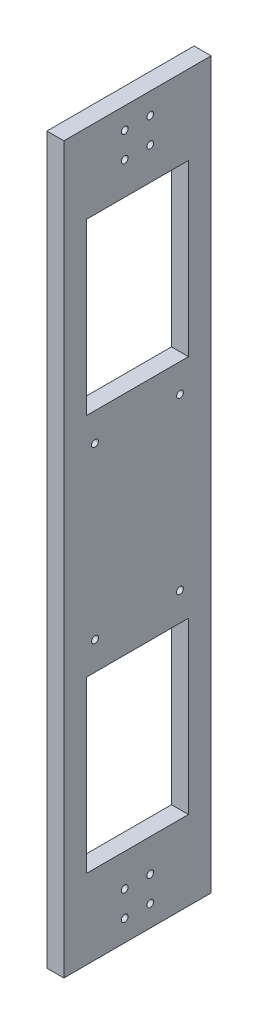
ISO-10303-21;
HEADER;
FILE_DESCRIPTION(('STEP AP214'),'2;1');
FILE_NAME('part.step','',(''),(''),'','','');
FILE_SCHEMA(('AUTOMOTIVE_DESIGN { 1 0 10303 214 1 1 1 1 }'));
ENDSEC;
DATA;
#1=APPLICATION_CONTEXT('core data for automotive mechanical design processes');
#2=APPLICATION_PROTOCOL_DEFINITION('international standard','automotive_design',2000,#1);
#3=PRODUCT_CONTEXT('',#1,'mechanical');
#4=PRODUCT('Part','Part','',(#3));
#5=PRODUCT_RELATED_PRODUCT_CATEGORY('part','',(#4));
#6=PRODUCT_DEFINITION_FORMATION('','',#4);
#7=PRODUCT_DEFINITION_CONTEXT('part definition',#1,'design');
#8=PRODUCT_DEFINITION('design','',#6,#7);
#9=PRODUCT_DEFINITION_SHAPE('','',#8);
#10=(LENGTH_UNIT() NAMED_UNIT(*) SI_UNIT(.MILLI.,.METRE.));
#11=(NAMED_UNIT(*) PLANE_ANGLE_UNIT() SI_UNIT($,.RADIAN.));
#12=(NAMED_UNIT(*) SI_UNIT($,.STERADIAN.) SOLID_ANGLE_UNIT());
#13=UNCERTAINTY_MEASURE_WITH_UNIT(LENGTH_MEASURE(1.E-05),#10,'distance_accuracy_value','');
#14=(GEOMETRIC_REPRESENTATION_CONTEXT(3) GLOBAL_UNCERTAINTY_ASSIGNED_CONTEXT((#13)) GLOBAL_UNIT_ASSIGNED_CONTEXT((#10,
#11,#12)) REPRESENTATION_CONTEXT('',''));
#15=CARTESIAN_POINT('',(0.,0.,0.));
#16=DIRECTION('',(0.,0.,1.));
#17=DIRECTION('',(1.,0.,0.));
#18=AXIS2_PLACEMENT_3D('',#15,#16,#17);
#19=CARTESIAN_POINT('',(-151.1,0.,0.));
#20=DIRECTION('',(-1.,0.,0.));
#21=DIRECTION('',(0.,0.,1.));
#22=AXIS2_PLACEMENT_3D('',#19,#20,#21);
#23=PLANE('',#22);
#24=DIRECTION('',(0.,-1.,0.));
#25=VECTOR('',#24,1.);
#26=CARTESIAN_POINT('',(-151.1,40.,18.));
#27=LINE('',#26,#25);
#28=CARTESIAN_POINT('',(-151.1,100.,18.));
#29=VERTEX_POINT('',#28);
#30=CARTESIAN_POINT('',(-151.1,40.,18.));
#31=VERTEX_POINT('',#30);
#32=EDGE_CURVE('E177',#29,#31,#27,.T.);
#33=ORIENTED_EDGE('',*,*,#32,.F.);
#34=DIRECTION('',(0.,0.,1.));
#35=VECTOR('',#34,1.);
#36=CARTESIAN_POINT('',(-151.1,100.,18.));
#37=LINE('',#36,#35);
#38=CARTESIAN_POINT('',(-151.1,100.,-18.));
#39=VERTEX_POINT('',#38);
#40=EDGE_CURVE('E188',#39,#29,#37,.T.);
#41=ORIENTED_EDGE('',*,*,#40,.F.);
#42=DIRECTION('',(0.,1.,0.));
#43=VECTOR('',#42,1.);
#44=CARTESIAN_POINT('',(-151.1,40.,-18.));
#45=LINE('',#44,#43);
#46=CARTESIAN_POINT('',(-151.1,40.,-18.));
#47=VERTEX_POINT('',#46);
#48=EDGE_CURVE('E184',#47,#39,#45,.T.);
#49=ORIENTED_EDGE('',*,*,#48,.F.);
#50=DIRECTION('',(0.,0.,-1.));
#51=VECTOR('',#50,1.);
#52=CARTESIAN_POINT('',(-151.1,40.,18.));
#53=LINE('',#52,#51);
#54=EDGE_CURVE('E180',#31,#47,#53,.T.);
#55=ORIENTED_EDGE('',*,*,#54,.F.);
#56=EDGE_LOOP('',(#33,#41,#49,#55));
#57=FACE_BOUND('',#56,.T.);
#58=CARTESIAN_POINT('',(-151.1,30.,15.));
#59=DIRECTION('',(-1.,0.,0.));
#60=DIRECTION('',(0.,0.,1.));
#61=AXIS2_PLACEMENT_3D('',#58,#59,#60);
#62=CIRCLE('',#61,1.19999999999999);
#63=CARTESIAN_POINT('',(-151.1,30.,16.2));
#64=VERTEX_POINT('',#63);
#65=EDGE_CURVE('E223',#64,#64,#62,.T.);
#66=ORIENTED_EDGE('',*,*,#65,.T.);
#67=EDGE_LOOP('',(#66));
#68=FACE_BOUND('',#67,.T.);
#69=CARTESIAN_POINT('',(-151.1,30.,-15.));
#70=DIRECTION('',(-1.,0.,0.));
#71=DIRECTION('',(0.,0.,1.));
#72=AXIS2_PLACEMENT_3D('',#69,#70,#71);
#73=CIRCLE('',#72,1.19999999999999);
#74=CARTESIAN_POINT('',(-151.1,30.,-13.8));
#75=VERTEX_POINT('',#74);
#76=EDGE_CURVE('E231',#75,#75,#73,.T.);
#77=ORIENTED_EDGE('',*,*,#76,.T.);
#78=EDGE_LOOP('',(#77));
#79=FACE_BOUND('',#78,.T.);
#80=CARTESIAN_POINT('',(-151.1,-30.,15.));
#81=DIRECTION('',(-1.,0.,0.));
#82=DIRECTION('',(0.,0.,1.));
#83=AXIS2_PLACEMENT_3D('',#80,#81,#82);
#84=CIRCLE('',#83,1.19999999999999);
#85=CARTESIAN_POINT('',(-151.1,-30.,16.2));
#86=VERTEX_POINT('',#85);
#87=EDGE_CURVE('E239',#86,#86,#84,.T.);
#88=ORIENTED_EDGE('',*,*,#87,.T.);
#89=EDGE_LOOP('',(#88));
#90=FACE_BOUND('',#89,.T.);
#91=CARTESIAN_POINT('',(-151.1,-30.,-15.));
#92=DIRECTION('',(-1.,0.,0.));
#93=DIRECTION('',(0.,0.,1.));
#94=AXIS2_PLACEMENT_3D('',#91,#92,#93);
#95=CIRCLE('',#94,1.19999999999999);
#96=CARTESIAN_POINT('',(-151.1,-30.,-13.8));
#97=VERTEX_POINT('',#96);
#98=EDGE_CURVE('E247',#97,#97,#95,.T.);
#99=ORIENTED_EDGE('',*,*,#98,.T.);
#100=EDGE_LOOP('',(#99));
#101=FACE_BOUND('',#100,.T.);
#102=CARTESIAN_POINT('',(-151.1,-111.5,4.5));
#103=DIRECTION('',(-1.,0.,0.));
#104=DIRECTION('',(0.,0.,1.));
#105=AXIS2_PLACEMENT_3D('',#102,#103,#104);
#106=CIRCLE('',#105,1.19999999999999);
#107=CARTESIAN_POINT('',(-151.1,-111.5,5.69999999999999));
#108=VERTEX_POINT('',#107);
#109=EDGE_CURVE('E255',#108,#108,#106,.T.);
#110=ORIENTED_EDGE('',*,*,#109,.T.);
#111=EDGE_LOOP('',(#110));
#112=FACE_BOUND('',#111,.T.);
#113=CARTESIAN_POINT('',(-151.1,-111.5,-4.5));
#114=DIRECTION('',(-1.,0.,0.));
#115=DIRECTION('',(0.,0.,1.));
#116=AXIS2_PLACEMENT_3D('',#113,#114,#115);
#117=CIRCLE('',#116,1.19999999999999);
#118=CARTESIAN_POINT('',(-151.1,-111.5,-3.30000000000001));
#119=VERTEX_POINT('',#118);
#120=EDGE_CURVE('E263',#119,#119,#117,.T.);
#121=ORIENTED_EDGE('',*,*,#120,.T.);
#122=EDGE_LOOP('',(#121));
#123=FACE_BOUND('',#122,.T.);
#124=CARTESIAN_POINT('',(-151.1,-120.5,4.5));
#125=DIRECTION('',(-1.,0.,0.));
#126=DIRECTION('',(0.,0.,1.));
#127=AXIS2_PLACEMENT_3D('',#124,#125,#126);
#128=CIRCLE('',#127,1.19999999999999);
#129=CARTESIAN_POINT('',(-151.1,-120.5,5.69999999999999));
#130=VERTEX_POINT('',#129);
#131=EDGE_CURVE('E271',#130,#130,#128,.T.);
#132=ORIENTED_EDGE('',*,*,#131,.T.);
#133=EDGE_LOOP('',(#132));
#134=FACE_BOUND('',#133,.T.);
#135=CARTESIAN_POINT('',(-151.1,-120.5,-4.5));
#136=DIRECTION('',(-1.,0.,0.));
#137=DIRECTION('',(0.,0.,1.));
#138=AXIS2_PLACEMENT_3D('',#135,#136,#137);
#139=CIRCLE('',#138,1.19999999999999);
#140=CARTESIAN_POINT('',(-151.1,-120.5,-3.30000000000001));
#141=VERTEX_POINT('',#140);
#142=EDGE_CURVE('E279',#141,#141,#139,.T.);
#143=ORIENTED_EDGE('',*,*,#142,.T.);
#144=EDGE_LOOP('',(#143));
#145=FACE_BOUND('',#144,.T.);
#146=CARTESIAN_POINT('',(-151.1,120.5,4.5));
#147=DIRECTION('',(-1.,0.,0.));
#148=DIRECTION('',(0.,0.,1.));
#149=AXIS2_PLACEMENT_3D('',#146,#147,#148);
#150=CIRCLE('',#149,1.19999999999999);
#151=CARTESIAN_POINT('',(-151.1,120.5,5.69999999999999));
#152=VERTEX_POINT('',#151);
#153=EDGE_CURVE('E287',#152,#152,#150,.T.);
#154=ORIENTED_EDGE('',*,*,#153,.T.);
#155=EDGE_LOOP('',(#154));
#156=FACE_BOUND('',#155,.T.);
#157=CARTESIAN_POINT('',(-151.1,120.5,-4.5));
#158=DIRECTION('',(-1.,0.,0.));
#159=DIRECTION('',(0.,0.,1.));
#160=AXIS2_PLACEMENT_3D('',#157,#158,#159);
#161=CIRCLE('',#160,1.19999999999999);
#162=CARTESIAN_POINT('',(-151.1,120.5,-3.30000000000001));
#163=VERTEX_POINT('',#162);
#164=EDGE_CURVE('E295',#163,#163,#161,.T.);
#165=ORIENTED_EDGE('',*,*,#164,.T.);
#166=EDGE_LOOP('',(#165));
#167=FACE_BOUND('',#166,.T.);
#168=CARTESIAN_POINT('',(-151.1,111.5,4.5));
#169=DIRECTION('',(-1.,0.,0.));
#170=DIRECTION('',(0.,0.,1.));
#171=AXIS2_PLACEMENT_3D('',#168,#169,#170);
#172=CIRCLE('',#171,1.19999999999999);
#173=CARTESIAN_POINT('',(-151.1,111.5,5.69999999999999));
#174=VERTEX_POINT('',#173);
#175=EDGE_CURVE('E303',#174,#174,#172,.T.);
#176=ORIENTED_EDGE('',*,*,#175,.T.);
#177=EDGE_LOOP('',(#176));
#178=FACE_BOUND('',#177,.T.);
#179=CARTESIAN_POINT('',(-151.1,111.5,-4.5));
#180=DIRECTION('',(-1.,0.,0.));
#181=DIRECTION('',(0.,0.,1.));
#182=AXIS2_PLACEMENT_3D('',#179,#180,#181);
#183=CIRCLE('',#182,1.19999999999999);
#184=CARTESIAN_POINT('',(-151.1,111.5,-3.30000000000001));
#185=VERTEX_POINT('',#184);
#186=EDGE_CURVE('E311',#185,#185,#183,.T.);
#187=ORIENTED_EDGE('',*,*,#186,.T.);
#188=EDGE_LOOP('',(#187));
#189=FACE_BOUND('',#188,.T.);
#190=DIRECTION('',(0.,-1.,0.));
#191=VECTOR('',#190,1.);
#192=CARTESIAN_POINT('',(-151.1,-128.,26.));
#193=LINE('',#192,#191);
#194=CARTESIAN_POINT('',(-151.1,128.,26.));
#195=VERTEX_POINT('',#194);
#196=CARTESIAN_POINT('',(-151.1,-128.,26.));
#197=VERTEX_POINT('',#196);
#198=EDGE_CURVE('E316',#195,#197,#193,.T.);
#199=ORIENTED_EDGE('',*,*,#198,.T.);
#200=DIRECTION('',(0.,0.,-1.));
#201=VECTOR('',#200,1.);
#202=CARTESIAN_POINT('',(-151.1,-128.,26.));
#203=LINE('',#202,#201);
#204=CARTESIAN_POINT('',(-151.1,-128.,-26.));
#205=VERTEX_POINT('',#204);
#206=EDGE_CURVE('E320',#197,#205,#203,.T.);
#207=ORIENTED_EDGE('',*,*,#206,.T.);
#208=DIRECTION('',(0.,1.,0.));
#209=VECTOR('',#208,1.);
#210=CARTESIAN_POINT('',(-151.1,-128.,-26.));
#211=LINE('',#210,#209);
#212=CARTESIAN_POINT('',(-151.1,128.,-26.));
#213=VERTEX_POINT('',#212);
#214=EDGE_CURVE('E324',#205,#213,#211,.T.);
#215=ORIENTED_EDGE('',*,*,#214,.T.);
#216=DIRECTION('',(0.,0.,1.));
#217=VECTOR('',#216,1.);
#218=CARTESIAN_POINT('',(-151.1,128.,26.));
#219=LINE('',#218,#217);
#220=EDGE_CURVE('E327',#213,#195,#219,.T.);
#221=ORIENTED_EDGE('',*,*,#220,.T.);
#222=EDGE_LOOP('',(#199,#207,#215,#221));
#223=FACE_BOUND('',#222,.T.);
#224=DIRECTION('',(0.,-1.,0.));
#225=VECTOR('',#224,1.);
#226=CARTESIAN_POINT('',(-151.1,-100.,18.));
#227=LINE('',#226,#225);
#228=CARTESIAN_POINT('',(-151.1,-40.,18.));
#229=VERTEX_POINT('',#228);
#230=CARTESIAN_POINT('',(-151.1,-100.,18.));
#231=VERTEX_POINT('',#230);
#232=EDGE_CURVE('E129',#229,#231,#227,.T.);
#233=ORIENTED_EDGE('',*,*,#232,.F.);
#234=DIRECTION('',(0.,0.,1.));
#235=VECTOR('',#234,1.);
#236=CARTESIAN_POINT('',(-151.1,-40.,18.));
#237=LINE('',#236,#235);
#238=CARTESIAN_POINT('',(-151.1,-40.,-18.));
#239=VERTEX_POINT('',#238);
#240=EDGE_CURVE('E155',#239,#229,#237,.T.);
#241=ORIENTED_EDGE('',*,*,#240,.F.);
#242=DIRECTION('',(0.,1.,0.));
#243=VECTOR('',#242,1.);
#244=CARTESIAN_POINT('',(-151.1,-100.,-18.));
#245=LINE('',#244,#243);
#246=CARTESIAN_POINT('',(-151.1,-100.,-18.));
#247=VERTEX_POINT('',#246);
#248=EDGE_CURVE('E151',#247,#239,#245,.T.);
#249=ORIENTED_EDGE('',*,*,#248,.F.);
#250=DIRECTION('',(0.,0.,-1.));
#251=VECTOR('',#250,1.);
#252=CARTESIAN_POINT('',(-151.1,-100.,18.));
#253=LINE('',#252,#251);
#254=EDGE_CURVE('E138',#231,#247,#253,.T.);
#255=ORIENTED_EDGE('',*,*,#254,.F.);
#256=EDGE_LOOP('',(#233,#241,#249,#255));
#257=FACE_BOUND('',#256,.T.);
#258=ADVANCED_FACE('F39',(#57,#68,#79,#90,#101,#112,#123,#134,#145,#156,#167,#178,#189,#223,
#257),#23,.F.);
#259=CARTESIAN_POINT('',(-157.1,0.,0.));
#260=DIRECTION('',(-1.,0.,0.));
#261=DIRECTION('',(0.,0.,1.));
#262=AXIS2_PLACEMENT_3D('',#259,#260,#261);
#263=PLANE('',#262);
#264=CARTESIAN_POINT('',(-157.1,30.,15.));
#265=DIRECTION('',(-1.,0.,0.));
#266=DIRECTION('',(0.,0.,1.));
#267=AXIS2_PLACEMENT_3D('',#264,#265,#266);
#268=CIRCLE('',#267,1.19999999999999);
#269=CARTESIAN_POINT('',(-157.1,30.,16.2));
#270=VERTEX_POINT('',#269);
#271=EDGE_CURVE('E219',#270,#270,#268,.T.);
#272=ORIENTED_EDGE('',*,*,#271,.F.);
#273=EDGE_LOOP('',(#272));
#274=FACE_BOUND('',#273,.T.);
#275=CARTESIAN_POINT('',(-157.1,30.,-15.));
#276=DIRECTION('',(-1.,0.,0.));
#277=DIRECTION('',(0.,0.,1.));
#278=AXIS2_PLACEMENT_3D('',#275,#276,#277);
#279=CIRCLE('',#278,1.19999999999999);
#280=CARTESIAN_POINT('',(-157.1,30.,-13.8));
#281=VERTEX_POINT('',#280);
#282=EDGE_CURVE('E227',#281,#281,#279,.T.);
#283=ORIENTED_EDGE('',*,*,#282,.F.);
#284=EDGE_LOOP('',(#283));
#285=FACE_BOUND('',#284,.T.);
#286=CARTESIAN_POINT('',(-157.1,-30.,15.));
#287=DIRECTION('',(-1.,0.,0.));
#288=DIRECTION('',(0.,0.,1.));
#289=AXIS2_PLACEMENT_3D('',#286,#287,#288);
#290=CIRCLE('',#289,1.19999999999999);
#291=CARTESIAN_POINT('',(-157.1,-30.,16.2));
#292=VERTEX_POINT('',#291);
#293=EDGE_CURVE('E235',#292,#292,#290,.T.);
#294=ORIENTED_EDGE('',*,*,#293,.F.);
#295=EDGE_LOOP('',(#294));
#296=FACE_BOUND('',#295,.T.);
#297=CARTESIAN_POINT('',(-157.1,-30.,-15.));
#298=DIRECTION('',(-1.,0.,0.));
#299=DIRECTION('',(0.,0.,1.));
#300=AXIS2_PLACEMENT_3D('',#297,#298,#299);
#301=CIRCLE('',#300,1.19999999999999);
#302=CARTESIAN_POINT('',(-157.1,-30.,-13.8));
#303=VERTEX_POINT('',#302);
#304=EDGE_CURVE('E243',#303,#303,#301,.T.);
#305=ORIENTED_EDGE('',*,*,#304,.F.);
#306=EDGE_LOOP('',(#305));
#307=FACE_BOUND('',#306,.T.);
#308=CARTESIAN_POINT('',(-157.1,-111.5,4.5));
#309=DIRECTION('',(-1.,0.,0.));
#310=DIRECTION('',(0.,0.,1.));
#311=AXIS2_PLACEMENT_3D('',#308,#309,#310);
#312=CIRCLE('',#311,1.19999999999999);
#313=CARTESIAN_POINT('',(-157.1,-111.5,5.69999999999999));
#314=VERTEX_POINT('',#313);
#315=EDGE_CURVE('E251',#314,#314,#312,.T.);
#316=ORIENTED_EDGE('',*,*,#315,.F.);
#317=EDGE_LOOP('',(#316));
#318=FACE_BOUND('',#317,.T.);
#319=CARTESIAN_POINT('',(-157.1,-111.5,-4.5));
#320=DIRECTION('',(-1.,0.,0.));
#321=DIRECTION('',(0.,0.,1.));
#322=AXIS2_PLACEMENT_3D('',#319,#320,#321);
#323=CIRCLE('',#322,1.19999999999999);
#324=CARTESIAN_POINT('',(-157.1,-111.5,-3.30000000000001));
#325=VERTEX_POINT('',#324);
#326=EDGE_CURVE('E259',#325,#325,#323,.T.);
#327=ORIENTED_EDGE('',*,*,#326,.F.);
#328=EDGE_LOOP('',(#327));
#329=FACE_BOUND('',#328,.T.);
#330=CARTESIAN_POINT('',(-157.1,-120.5,4.5));
#331=DIRECTION('',(-1.,0.,0.));
#332=DIRECTION('',(0.,0.,1.));
#333=AXIS2_PLACEMENT_3D('',#330,#331,#332);
#334=CIRCLE('',#333,1.19999999999999);
#335=CARTESIAN_POINT('',(-157.1,-120.5,5.69999999999999));
#336=VERTEX_POINT('',#335);
#337=EDGE_CURVE('E267',#336,#336,#334,.T.);
#338=ORIENTED_EDGE('',*,*,#337,.F.);
#339=EDGE_LOOP('',(#338));
#340=FACE_BOUND('',#339,.T.);
#341=CARTESIAN_POINT('',(-157.1,-120.5,-4.5));
#342=DIRECTION('',(-1.,0.,0.));
#343=DIRECTION('',(0.,0.,1.));
#344=AXIS2_PLACEMENT_3D('',#341,#342,#343);
#345=CIRCLE('',#344,1.19999999999999);
#346=CARTESIAN_POINT('',(-157.1,-120.5,-3.30000000000001));
#347=VERTEX_POINT('',#346);
#348=EDGE_CURVE('E275',#347,#347,#345,.T.);
#349=ORIENTED_EDGE('',*,*,#348,.F.);
#350=EDGE_LOOP('',(#349));
#351=FACE_BOUND('',#350,.T.);
#352=CARTESIAN_POINT('',(-157.1,120.5,4.5));
#353=DIRECTION('',(-1.,0.,0.));
#354=DIRECTION('',(0.,0.,1.));
#355=AXIS2_PLACEMENT_3D('',#352,#353,#354);
#356=CIRCLE('',#355,1.19999999999999);
#357=CARTESIAN_POINT('',(-157.1,120.5,5.69999999999999));
#358=VERTEX_POINT('',#357);
#359=EDGE_CURVE('E283',#358,#358,#356,.T.);
#360=ORIENTED_EDGE('',*,*,#359,.F.);
#361=EDGE_LOOP('',(#360));
#362=FACE_BOUND('',#361,.T.);
#363=CARTESIAN_POINT('',(-157.1,120.5,-4.5));
#364=DIRECTION('',(-1.,0.,0.));
#365=DIRECTION('',(0.,0.,1.));
#366=AXIS2_PLACEMENT_3D('',#363,#364,#365);
#367=CIRCLE('',#366,1.19999999999999);
#368=CARTESIAN_POINT('',(-157.1,120.5,-3.30000000000001));
#369=VERTEX_POINT('',#368);
#370=EDGE_CURVE('E291',#369,#369,#367,.T.);
#371=ORIENTED_EDGE('',*,*,#370,.F.);
#372=EDGE_LOOP('',(#371));
#373=FACE_BOUND('',#372,.T.);
#374=CARTESIAN_POINT('',(-157.1,111.5,4.5));
#375=DIRECTION('',(-1.,0.,0.));
#376=DIRECTION('',(0.,0.,1.));
#377=AXIS2_PLACEMENT_3D('',#374,#375,#376);
#378=CIRCLE('',#377,1.19999999999999);
#379=CARTESIAN_POINT('',(-157.1,111.5,5.69999999999999));
#380=VERTEX_POINT('',#379);
#381=EDGE_CURVE('E299',#380,#380,#378,.T.);
#382=ORIENTED_EDGE('',*,*,#381,.F.);
#383=EDGE_LOOP('',(#382));
#384=FACE_BOUND('',#383,.T.);
#385=CARTESIAN_POINT('',(-157.1,111.5,-4.5));
#386=DIRECTION('',(-1.,0.,0.));
#387=DIRECTION('',(0.,0.,1.));
#388=AXIS2_PLACEMENT_3D('',#385,#386,#387);
#389=CIRCLE('',#388,1.19999999999999);
#390=CARTESIAN_POINT('',(-157.1,111.5,-3.30000000000001));
#391=VERTEX_POINT('',#390);
#392=EDGE_CURVE('E307',#391,#391,#389,.T.);
#393=ORIENTED_EDGE('',*,*,#392,.F.);
#394=EDGE_LOOP('',(#393));
#395=FACE_BOUND('',#394,.T.);
#396=DIRECTION('',(0.,-1.,0.));
#397=VECTOR('',#396,1.);
#398=CARTESIAN_POINT('',(-157.1,-128.,26.));
#399=LINE('',#398,#397);
#400=CARTESIAN_POINT('',(-157.1,128.,26.));
#401=VERTEX_POINT('',#400);
#402=CARTESIAN_POINT('',(-157.1,-128.,26.));
#403=VERTEX_POINT('',#402);
#404=EDGE_CURVE('E315',#401,#403,#399,.T.);
#405=ORIENTED_EDGE('',*,*,#404,.F.);
#406=DIRECTION('',(0.,0.,1.));
#407=VECTOR('',#406,1.);
#408=CARTESIAN_POINT('',(-157.1,128.,26.));
#409=LINE('',#408,#407);
#410=CARTESIAN_POINT('',(-157.1,128.,-26.));
#411=VERTEX_POINT('',#410);
#412=EDGE_CURVE('E321',#411,#401,#409,.T.);
#413=ORIENTED_EDGE('',*,*,#412,.F.);
#414=DIRECTION('',(0.,1.,0.));
#415=VECTOR('',#414,1.);
#416=CARTESIAN_POINT('',(-157.1,-128.,-26.));
#417=LINE('',#416,#415);
#418=CARTESIAN_POINT('',(-157.1,-128.,-26.));
#419=VERTEX_POINT('',#418);
#420=EDGE_CURVE('E337',#419,#411,#417,.T.);
#421=ORIENTED_EDGE('',*,*,#420,.F.);
#422=DIRECTION('',(0.,0.,-1.));
#423=VECTOR('',#422,1.);
#424=CARTESIAN_POINT('',(-157.1,-128.,26.));
#425=LINE('',#424,#423);
#426=EDGE_CURVE('E334',#403,#419,#425,.T.);
#427=ORIENTED_EDGE('',*,*,#426,.F.);
#428=EDGE_LOOP('',(#405,#413,#421,#427));
#429=FACE_BOUND('',#428,.T.);
#430=DIRECTION('',(0.,0.,1.));
#431=VECTOR('',#430,1.);
#432=CARTESIAN_POINT('',(-157.1,100.,18.));
#433=LINE('',#432,#431);
#434=CARTESIAN_POINT('',(-157.1,100.,-18.));
#435=VERTEX_POINT('',#434);
#436=CARTESIAN_POINT('',(-157.1,100.,18.));
#437=VERTEX_POINT('',#436);
#438=EDGE_CURVE('E181',#435,#437,#433,.T.);
#439=ORIENTED_EDGE('',*,*,#438,.T.);
#440=DIRECTION('',(0.,-1.,0.));
#441=VECTOR('',#440,1.);
#442=CARTESIAN_POINT('',(-157.1,40.,18.));
#443=LINE('',#442,#441);
#444=CARTESIAN_POINT('',(-157.1,40.,18.));
#445=VERTEX_POINT('',#444);
#446=EDGE_CURVE('E147',#437,#445,#443,.T.);
#447=ORIENTED_EDGE('',*,*,#446,.T.);
#448=DIRECTION('',(0.,0.,-1.));
#449=VECTOR('',#448,1.);
#450=CARTESIAN_POINT('',(-157.1,40.,18.));
#451=LINE('',#450,#449);
#452=CARTESIAN_POINT('',(-157.1,40.,-18.));
#453=VERTEX_POINT('',#452);
#454=EDGE_CURVE('E195',#445,#453,#451,.T.);
#455=ORIENTED_EDGE('',*,*,#454,.T.);
#456=DIRECTION('',(0.,1.,0.));
#457=VECTOR('',#456,1.);
#458=CARTESIAN_POINT('',(-157.1,40.,-18.));
#459=LINE('',#458,#457);
#460=EDGE_CURVE('E199',#453,#435,#459,.T.);
#461=ORIENTED_EDGE('',*,*,#460,.T.);
#462=EDGE_LOOP('',(#439,#447,#455,#461));
#463=FACE_BOUND('',#462,.T.);
#464=DIRECTION('',(0.,0.,1.));
#465=VECTOR('',#464,1.);
#466=CARTESIAN_POINT('',(-157.1,-40.,18.));
#467=LINE('',#466,#465);
#468=CARTESIAN_POINT('',(-157.1,-40.,-18.));
#469=VERTEX_POINT('',#468);
#470=CARTESIAN_POINT('',(-157.1,-40.,18.));
#471=VERTEX_POINT('',#470);
#472=EDGE_CURVE('E139',#469,#471,#467,.T.);
#473=ORIENTED_EDGE('',*,*,#472,.T.);
#474=DIRECTION('',(0.,-1.,0.));
#475=VECTOR('',#474,1.);
#476=CARTESIAN_POINT('',(-157.1,-100.,18.));
#477=LINE('',#476,#475);
#478=CARTESIAN_POINT('',(-157.1,-100.,18.));
#479=VERTEX_POINT('',#478);
#480=EDGE_CURVE('E63',#471,#479,#477,.T.);
#481=ORIENTED_EDGE('',*,*,#480,.T.);
#482=DIRECTION('',(0.,0.,-1.));
#483=VECTOR('',#482,1.);
#484=CARTESIAN_POINT('',(-157.1,-100.,18.));
#485=LINE('',#484,#483);
#486=CARTESIAN_POINT('',(-157.1,-100.,-18.));
#487=VERTEX_POINT('',#486);
#488=EDGE_CURVE('E145',#479,#487,#485,.T.);
#489=ORIENTED_EDGE('',*,*,#488,.T.);
#490=DIRECTION('',(0.,1.,0.));
#491=VECTOR('',#490,1.);
#492=CARTESIAN_POINT('',(-157.1,-100.,-18.));
#493=LINE('',#492,#491);
#494=EDGE_CURVE('E164',#487,#469,#493,.T.);
#495=ORIENTED_EDGE('',*,*,#494,.T.);
#496=EDGE_LOOP('',(#473,#481,#489,#495));
#497=FACE_BOUND('',#496,.T.);
#498=ADVANCED_FACE('F360',(#274,#285,#296,#307,#318,#329,#340,#351,#362,#373,#384,#395,#429,
#463,#497),#263,.T.);
#499=CARTESIAN_POINT('',(-151.1,-128.,26.));
#500=DIRECTION('',(0.,0.,-1.));
#501=DIRECTION('',(-1.,0.,0.));
#502=AXIS2_PLACEMENT_3D('',#499,#500,#501);
#503=PLANE('',#502);
#504=ORIENTED_EDGE('',*,*,#404,.T.);
#505=DIRECTION('',(-1.,0.,0.));
#506=VECTOR('',#505,1.);
#507=CARTESIAN_POINT('',(-151.1,-128.,26.));
#508=LINE('',#507,#506);
#509=EDGE_CURVE('E11',#197,#403,#508,.T.);
#510=ORIENTED_EDGE('',*,*,#509,.F.);
#511=ORIENTED_EDGE('',*,*,#198,.F.);
#512=DIRECTION('',(-1.,0.,0.));
#513=VECTOR('',#512,1.);
#514=CARTESIAN_POINT('',(-151.1,128.,26.));
#515=LINE('',#514,#513);
#516=EDGE_CURVE('E330',#195,#401,#515,.T.);
#517=ORIENTED_EDGE('',*,*,#516,.T.);
#518=EDGE_LOOP('',(#504,#510,#511,#517));
#519=FACE_BOUND('',#518,.T.);
#520=ADVANCED_FACE('F41',(#519),#503,.F.);
#521=CARTESIAN_POINT('',(-151.1,-128.,26.));
#522=DIRECTION('',(0.,1.,0.));
#523=DIRECTION('',(0.,0.,1.));
#524=AXIS2_PLACEMENT_3D('',#521,#522,#523);
#525=PLANE('',#524);
#526=ORIENTED_EDGE('',*,*,#426,.T.);
#527=DIRECTION('',(-1.,0.,0.));
#528=VECTOR('',#527,1.);
#529=CARTESIAN_POINT('',(-151.1,-128.,-26.));
#530=LINE('',#529,#528);
#531=EDGE_CURVE('E48',#205,#419,#530,.T.);
#532=ORIENTED_EDGE('',*,*,#531,.F.);
#533=ORIENTED_EDGE('',*,*,#206,.F.);
#534=ORIENTED_EDGE('',*,*,#509,.T.);
#535=EDGE_LOOP('',(#526,#532,#533,#534));
#536=FACE_BOUND('',#535,.T.);
#537=ADVANCED_FACE('F370',(#536),#525,.F.);
#538=CARTESIAN_POINT('',(-151.1,-128.,-26.));
#539=DIRECTION('',(0.,0.,1.));
#540=DIRECTION('',(1.,0.,0.));
#541=AXIS2_PLACEMENT_3D('',#538,#539,#540);
#542=PLANE('',#541);
#543=ORIENTED_EDGE('',*,*,#420,.T.);
#544=DIRECTION('',(-1.,0.,0.));
#545=VECTOR('',#544,1.);
#546=CARTESIAN_POINT('',(-151.1,128.,-26.));
#547=LINE('',#546,#545);
#548=EDGE_CURVE('E345',#213,#411,#547,.T.);
#549=ORIENTED_EDGE('',*,*,#548,.F.);
#550=ORIENTED_EDGE('',*,*,#214,.F.);
#551=ORIENTED_EDGE('',*,*,#531,.T.);
#552=EDGE_LOOP('',(#543,#549,#550,#551));
#553=FACE_BOUND('',#552,.T.);
#554=ADVANCED_FACE('F354',(#553),#542,.F.);
#555=CARTESIAN_POINT('',(-151.1,128.,26.));
#556=DIRECTION('',(0.,-1.,0.));
#557=DIRECTION('',(0.,0.,-1.));
#558=AXIS2_PLACEMENT_3D('',#555,#556,#557);
#559=PLANE('',#558);
#560=ORIENTED_EDGE('',*,*,#412,.T.);
#561=ORIENTED_EDGE('',*,*,#516,.F.);
#562=ORIENTED_EDGE('',*,*,#220,.F.);
#563=ORIENTED_EDGE('',*,*,#548,.T.);
#564=EDGE_LOOP('',(#560,#561,#562,#563));
#565=FACE_BOUND('',#564,.T.);
#566=ADVANCED_FACE('F364',(#565),#559,.F.);
#567=CARTESIAN_POINT('',(-157.1,111.5,-4.5));
#568=DIRECTION('',(-1.,0.,0.));
#569=DIRECTION('',(0.,0.,1.));
#570=AXIS2_PLACEMENT_3D('',#567,#568,#569);
#571=CYLINDRICAL_SURFACE('',#570,1.19999999999999);
#572=ORIENTED_EDGE('',*,*,#186,.F.);
#573=EDGE_LOOP('',(#572));
#574=FACE_BOUND('',#573,.T.);
#575=ORIENTED_EDGE('',*,*,#392,.T.);
#576=EDGE_LOOP('',(#575));
#577=FACE_BOUND('',#576,.T.);
#578=ADVANCED_FACE('F388',(#574,#577),#571,.F.);
#579=CARTESIAN_POINT('',(-157.1,111.5,4.5));
#580=DIRECTION('',(-1.,0.,0.));
#581=DIRECTION('',(0.,0.,1.));
#582=AXIS2_PLACEMENT_3D('',#579,#580,#581);
#583=CYLINDRICAL_SURFACE('',#582,1.19999999999999);
#584=ORIENTED_EDGE('',*,*,#175,.F.);
#585=EDGE_LOOP('',(#584));
#586=FACE_BOUND('',#585,.T.);
#587=ORIENTED_EDGE('',*,*,#381,.T.);
#588=EDGE_LOOP('',(#587));
#589=FACE_BOUND('',#588,.T.);
#590=ADVANCED_FACE('F395',(#586,#589),#583,.F.);
#591=CARTESIAN_POINT('',(-157.1,120.5,-4.5));
#592=DIRECTION('',(-1.,0.,0.));
#593=DIRECTION('',(0.,0.,1.));
#594=AXIS2_PLACEMENT_3D('',#591,#592,#593);
#595=CYLINDRICAL_SURFACE('',#594,1.19999999999999);
#596=ORIENTED_EDGE('',*,*,#164,.F.);
#597=EDGE_LOOP('',(#596));
#598=FACE_BOUND('',#597,.T.);
#599=ORIENTED_EDGE('',*,*,#370,.T.);
#600=EDGE_LOOP('',(#599));
#601=FACE_BOUND('',#600,.T.);
#602=ADVANCED_FACE('F400',(#598,#601),#595,.F.);
#603=CARTESIAN_POINT('',(-157.1,120.5,4.5));
#604=DIRECTION('',(-1.,0.,0.));
#605=DIRECTION('',(0.,0.,1.));
#606=AXIS2_PLACEMENT_3D('',#603,#604,#605);
#607=CYLINDRICAL_SURFACE('',#606,1.19999999999999);
#608=ORIENTED_EDGE('',*,*,#153,.F.);
#609=EDGE_LOOP('',(#608));
#610=FACE_BOUND('',#609,.T.);
#611=ORIENTED_EDGE('',*,*,#359,.T.);
#612=EDGE_LOOP('',(#611));
#613=FACE_BOUND('',#612,.T.);
#614=ADVANCED_FACE('F410',(#610,#613),#607,.F.);
#615=CARTESIAN_POINT('',(-157.1,-120.5,-4.5));
#616=DIRECTION('',(-1.,0.,0.));
#617=DIRECTION('',(0.,0.,1.));
#618=AXIS2_PLACEMENT_3D('',#615,#616,#617);
#619=CYLINDRICAL_SURFACE('',#618,1.19999999999999);
#620=ORIENTED_EDGE('',*,*,#142,.F.);
#621=EDGE_LOOP('',(#620));
#622=FACE_BOUND('',#621,.T.);
#623=ORIENTED_EDGE('',*,*,#348,.T.);
#624=EDGE_LOOP('',(#623));
#625=FACE_BOUND('',#624,.T.);
#626=ADVANCED_FACE('F418',(#622,#625),#619,.F.);
#627=CARTESIAN_POINT('',(-157.1,-120.5,4.5));
#628=DIRECTION('',(-1.,0.,0.));
#629=DIRECTION('',(0.,0.,1.));
#630=AXIS2_PLACEMENT_3D('',#627,#628,#629);
#631=CYLINDRICAL_SURFACE('',#630,1.19999999999999);
#632=ORIENTED_EDGE('',*,*,#131,.F.);
#633=EDGE_LOOP('',(#632));
#634=FACE_BOUND('',#633,.T.);
#635=ORIENTED_EDGE('',*,*,#337,.T.);
#636=EDGE_LOOP('',(#635));
#637=FACE_BOUND('',#636,.T.);
#638=ADVANCED_FACE('F422',(#634,#637),#631,.F.);
#639=CARTESIAN_POINT('',(-157.1,-111.5,-4.5));
#640=DIRECTION('',(-1.,0.,0.));
#641=DIRECTION('',(0.,0.,1.));
#642=AXIS2_PLACEMENT_3D('',#639,#640,#641);
#643=CYLINDRICAL_SURFACE('',#642,1.19999999999999);
#644=ORIENTED_EDGE('',*,*,#120,.F.);
#645=EDGE_LOOP('',(#644));
#646=FACE_BOUND('',#645,.T.);
#647=ORIENTED_EDGE('',*,*,#326,.T.);
#648=EDGE_LOOP('',(#647));
#649=FACE_BOUND('',#648,.T.);
#650=ADVANCED_FACE('F426',(#646,#649),#643,.F.);
#651=CARTESIAN_POINT('',(-157.1,-111.5,4.5));
#652=DIRECTION('',(-1.,0.,0.));
#653=DIRECTION('',(0.,0.,1.));
#654=AXIS2_PLACEMENT_3D('',#651,#652,#653);
#655=CYLINDRICAL_SURFACE('',#654,1.19999999999999);
#656=ORIENTED_EDGE('',*,*,#109,.F.);
#657=EDGE_LOOP('',(#656));
#658=FACE_BOUND('',#657,.T.);
#659=ORIENTED_EDGE('',*,*,#315,.T.);
#660=EDGE_LOOP('',(#659));
#661=FACE_BOUND('',#660,.T.);
#662=ADVANCED_FACE('F430',(#658,#661),#655,.F.);
#663=CARTESIAN_POINT('',(-157.1,-30.,-15.));
#664=DIRECTION('',(-1.,0.,0.));
#665=DIRECTION('',(0.,0.,1.));
#666=AXIS2_PLACEMENT_3D('',#663,#664,#665);
#667=CYLINDRICAL_SURFACE('',#666,1.19999999999999);
#668=ORIENTED_EDGE('',*,*,#98,.F.);
#669=EDGE_LOOP('',(#668));
#670=FACE_BOUND('',#669,.T.);
#671=ORIENTED_EDGE('',*,*,#304,.T.);
#672=EDGE_LOOP('',(#671));
#673=FACE_BOUND('',#672,.T.);
#674=ADVANCED_FACE('F434',(#670,#673),#667,.F.);
#675=CARTESIAN_POINT('',(-157.1,-30.,15.));
#676=DIRECTION('',(-1.,0.,0.));
#677=DIRECTION('',(0.,0.,1.));
#678=AXIS2_PLACEMENT_3D('',#675,#676,#677);
#679=CYLINDRICAL_SURFACE('',#678,1.19999999999999);
#680=ORIENTED_EDGE('',*,*,#87,.F.);
#681=EDGE_LOOP('',(#680));
#682=FACE_BOUND('',#681,.T.);
#683=ORIENTED_EDGE('',*,*,#293,.T.);
#684=EDGE_LOOP('',(#683));
#685=FACE_BOUND('',#684,.T.);
#686=ADVANCED_FACE('F438',(#682,#685),#679,.F.);
#687=CARTESIAN_POINT('',(-157.1,30.,-15.));
#688=DIRECTION('',(-1.,0.,0.));
#689=DIRECTION('',(0.,0.,1.));
#690=AXIS2_PLACEMENT_3D('',#687,#688,#689);
#691=CYLINDRICAL_SURFACE('',#690,1.19999999999999);
#692=ORIENTED_EDGE('',*,*,#76,.F.);
#693=EDGE_LOOP('',(#692));
#694=FACE_BOUND('',#693,.T.);
#695=ORIENTED_EDGE('',*,*,#282,.T.);
#696=EDGE_LOOP('',(#695));
#697=FACE_BOUND('',#696,.T.);
#698=ADVANCED_FACE('F442',(#694,#697),#691,.F.);
#699=CARTESIAN_POINT('',(-157.1,30.,15.));
#700=DIRECTION('',(-1.,0.,0.));
#701=DIRECTION('',(0.,0.,1.));
#702=AXIS2_PLACEMENT_3D('',#699,#700,#701);
#703=CYLINDRICAL_SURFACE('',#702,1.19999999999999);
#704=ORIENTED_EDGE('',*,*,#65,.F.);
#705=EDGE_LOOP('',(#704));
#706=FACE_BOUND('',#705,.T.);
#707=ORIENTED_EDGE('',*,*,#271,.T.);
#708=EDGE_LOOP('',(#707));
#709=FACE_BOUND('',#708,.T.);
#710=ADVANCED_FACE('F446',(#706,#709),#703,.F.);
#711=CARTESIAN_POINT('',(-151.1,40.,18.));
#712=DIRECTION('',(0.,0.,-1.));
#713=DIRECTION('',(-1.,0.,0.));
#714=AXIS2_PLACEMENT_3D('',#711,#712,#713);
#715=PLANE('',#714);
#716=ORIENTED_EDGE('',*,*,#446,.F.);
#717=DIRECTION('',(-1.,0.,0.));
#718=VECTOR('',#717,1.);
#719=CARTESIAN_POINT('',(-151.1,100.,18.));
#720=LINE('',#719,#718);
#721=EDGE_CURVE('E191',#29,#437,#720,.T.);
#722=ORIENTED_EDGE('',*,*,#721,.F.);
#723=ORIENTED_EDGE('',*,*,#32,.T.);
#724=DIRECTION('',(-1.,0.,0.));
#725=VECTOR('',#724,1.);
#726=CARTESIAN_POINT('',(-151.1,40.,18.));
#727=LINE('',#726,#725);
#728=EDGE_CURVE('E215',#31,#445,#727,.T.);
#729=ORIENTED_EDGE('',*,*,#728,.T.);
#730=EDGE_LOOP('',(#716,#722,#723,#729));
#731=FACE_BOUND('',#730,.T.);
#732=ADVANCED_FACE('F450',(#731),#715,.T.);
#733=CARTESIAN_POINT('',(-151.1,40.,18.));
#734=DIRECTION('',(0.,1.,0.));
#735=DIRECTION('',(0.,0.,1.));
#736=AXIS2_PLACEMENT_3D('',#733,#734,#735);
#737=PLANE('',#736);
#738=ORIENTED_EDGE('',*,*,#454,.F.);
#739=ORIENTED_EDGE('',*,*,#728,.F.);
#740=ORIENTED_EDGE('',*,*,#54,.T.);
#741=DIRECTION('',(-1.,0.,0.));
#742=VECTOR('',#741,1.);
#743=CARTESIAN_POINT('',(-151.1,40.,-18.));
#744=LINE('',#743,#742);
#745=EDGE_CURVE('E212',#47,#453,#744,.T.);
#746=ORIENTED_EDGE('',*,*,#745,.T.);
#747=EDGE_LOOP('',(#738,#739,#740,#746));
#748=FACE_BOUND('',#747,.T.);
#749=ADVANCED_FACE('F454',(#748),#737,.T.);
#750=CARTESIAN_POINT('',(-151.1,40.,-18.));
#751=DIRECTION('',(0.,0.,1.));
#752=DIRECTION('',(1.,0.,0.));
#753=AXIS2_PLACEMENT_3D('',#750,#751,#752);
#754=PLANE('',#753);
#755=ORIENTED_EDGE('',*,*,#460,.F.);
#756=ORIENTED_EDGE('',*,*,#745,.F.);
#757=ORIENTED_EDGE('',*,*,#48,.T.);
#758=DIRECTION('',(-1.,0.,0.));
#759=VECTOR('',#758,1.);
#760=CARTESIAN_POINT('',(-151.1,100.,-18.));
#761=LINE('',#760,#759);
#762=EDGE_CURVE('E209',#39,#435,#761,.T.);
#763=ORIENTED_EDGE('',*,*,#762,.T.);
#764=EDGE_LOOP('',(#755,#756,#757,#763));
#765=FACE_BOUND('',#764,.T.);
#766=ADVANCED_FACE('F458',(#765),#754,.T.);
#767=CARTESIAN_POINT('',(-151.1,100.,18.));
#768=DIRECTION('',(0.,-1.,0.));
#769=DIRECTION('',(0.,0.,-1.));
#770=AXIS2_PLACEMENT_3D('',#767,#768,#769);
#771=PLANE('',#770);
#772=ORIENTED_EDGE('',*,*,#438,.F.);
#773=ORIENTED_EDGE('',*,*,#762,.F.);
#774=ORIENTED_EDGE('',*,*,#40,.T.);
#775=ORIENTED_EDGE('',*,*,#721,.T.);
#776=EDGE_LOOP('',(#772,#773,#774,#775));
#777=FACE_BOUND('',#776,.T.);
#778=ADVANCED_FACE('F462',(#777),#771,.T.);
#779=CARTESIAN_POINT('',(-151.1,-100.,18.));
#780=DIRECTION('',(0.,0.,-1.));
#781=DIRECTION('',(-1.,0.,0.));
#782=AXIS2_PLACEMENT_3D('',#779,#780,#781);
#783=PLANE('',#782);
#784=ORIENTED_EDGE('',*,*,#480,.F.);
#785=DIRECTION('',(-1.,0.,0.));
#786=VECTOR('',#785,1.);
#787=CARTESIAN_POINT('',(-151.1,-40.,18.));
#788=LINE('',#787,#786);
#789=EDGE_CURVE('E133',#229,#471,#788,.T.);
#790=ORIENTED_EDGE('',*,*,#789,.F.);
#791=ORIENTED_EDGE('',*,*,#232,.T.);
#792=DIRECTION('',(-1.,0.,0.));
#793=VECTOR('',#792,1.);
#794=CARTESIAN_POINT('',(-151.1,-100.,18.));
#795=LINE('',#794,#793);
#796=EDGE_CURVE('E132',#231,#479,#795,.T.);
#797=ORIENTED_EDGE('',*,*,#796,.T.);
#798=EDGE_LOOP('',(#784,#790,#791,#797));
#799=FACE_BOUND('',#798,.T.);
#800=ADVANCED_FACE('F131',(#799),#783,.T.);
#801=CARTESIAN_POINT('',(-151.1,-100.,18.));
#802=DIRECTION('',(0.,1.,0.));
#803=DIRECTION('',(0.,0.,1.));
#804=AXIS2_PLACEMENT_3D('',#801,#802,#803);
#805=PLANE('',#804);
#806=ORIENTED_EDGE('',*,*,#488,.F.);
#807=ORIENTED_EDGE('',*,*,#796,.F.);
#808=ORIENTED_EDGE('',*,*,#254,.T.);
#809=DIRECTION('',(-1.,0.,0.));
#810=VECTOR('',#809,1.);
#811=CARTESIAN_POINT('',(-151.1,-100.,-18.));
#812=LINE('',#811,#810);
#813=EDGE_CURVE('E148',#247,#487,#812,.T.);
#814=ORIENTED_EDGE('',*,*,#813,.T.);
#815=EDGE_LOOP('',(#806,#807,#808,#814));
#816=FACE_BOUND('',#815,.T.);
#817=ADVANCED_FACE('F142',(#816),#805,.T.);
#818=CARTESIAN_POINT('',(-151.1,-100.,-18.));
#819=DIRECTION('',(0.,0.,1.));
#820=DIRECTION('',(1.,0.,0.));
#821=AXIS2_PLACEMENT_3D('',#818,#819,#820);
#822=PLANE('',#821);
#823=ORIENTED_EDGE('',*,*,#494,.F.);
#824=ORIENTED_EDGE('',*,*,#813,.F.);
#825=ORIENTED_EDGE('',*,*,#248,.T.);
#826=DIRECTION('',(-1.,0.,0.));
#827=VECTOR('',#826,1.);
#828=CARTESIAN_POINT('',(-151.1,-40.,-18.));
#829=LINE('',#828,#827);
#830=EDGE_CURVE('E55',#239,#469,#829,.T.);
#831=ORIENTED_EDGE('',*,*,#830,.T.);
#832=EDGE_LOOP('',(#823,#824,#825,#831));
#833=FACE_BOUND('',#832,.T.);
#834=ADVANCED_FACE('F471',(#833),#822,.T.);
#835=CARTESIAN_POINT('',(-151.1,-40.,18.));
#836=DIRECTION('',(0.,-1.,0.));
#837=DIRECTION('',(0.,0.,-1.));
#838=AXIS2_PLACEMENT_3D('',#835,#836,#837);
#839=PLANE('',#838);
#840=ORIENTED_EDGE('',*,*,#472,.F.);
#841=ORIENTED_EDGE('',*,*,#830,.F.);
#842=ORIENTED_EDGE('',*,*,#240,.T.);
#843=ORIENTED_EDGE('',*,*,#789,.T.);
#844=EDGE_LOOP('',(#840,#841,#842,#843));
#845=FACE_BOUND('',#844,.T.);
#846=ADVANCED_FACE('F474',(#845),#839,.T.);
#847=CLOSED_SHELL('',(#258,#498,#520,#537,#554,#566,#578,#590,#602,#614,#626,#638,#650,#662,
#674,#686,#698,#710,#732,#749,#766,#778,#800,#817,#834,#846));
#848=MANIFOLD_SOLID_BREP('B2',#847);
#849=ADVANCED_BREP_SHAPE_REPRESENTATION('',(#18,#848),#14);
#850=SHAPE_DEFINITION_REPRESENTATION(#9,#849);
ENDSEC;
END-ISO-10303-21;
